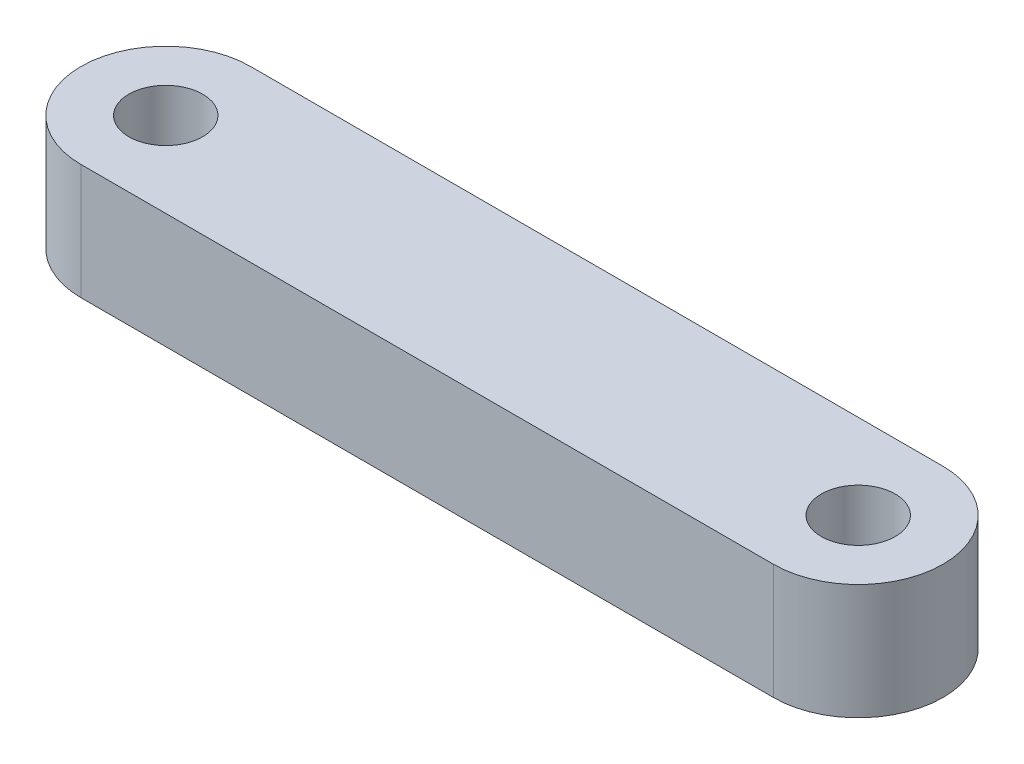
ISO-10303-21;
HEADER;
FILE_DESCRIPTION(('STEP AP214'),'2;1');
FILE_NAME('part.step','',(''),(''),'','','');
FILE_SCHEMA(('AUTOMOTIVE_DESIGN { 1 0 10303 214 1 1 1 1 }'));
ENDSEC;
DATA;
#1=APPLICATION_CONTEXT('core data for automotive mechanical design processes');
#2=APPLICATION_PROTOCOL_DEFINITION('international standard','automotive_design',2000,#1);
#3=PRODUCT_CONTEXT('',#1,'mechanical');
#4=PRODUCT('Part','Part','',(#3));
#5=PRODUCT_RELATED_PRODUCT_CATEGORY('part','',(#4));
#6=PRODUCT_DEFINITION_FORMATION('','',#4);
#7=PRODUCT_DEFINITION_CONTEXT('part definition',#1,'design');
#8=PRODUCT_DEFINITION('design','',#6,#7);
#9=PRODUCT_DEFINITION_SHAPE('','',#8);
#10=(LENGTH_UNIT() NAMED_UNIT(*) SI_UNIT(.MILLI.,.METRE.));
#11=(NAMED_UNIT(*) PLANE_ANGLE_UNIT() SI_UNIT($,.RADIAN.));
#12=(NAMED_UNIT(*) SI_UNIT($,.STERADIAN.) SOLID_ANGLE_UNIT());
#13=UNCERTAINTY_MEASURE_WITH_UNIT(LENGTH_MEASURE(1.E-05),#10,'distance_accuracy_value','');
#14=(GEOMETRIC_REPRESENTATION_CONTEXT(3) GLOBAL_UNCERTAINTY_ASSIGNED_CONTEXT((#13)) GLOBAL_UNIT_ASSIGNED_CONTEXT((#10,
#11,#12)) REPRESENTATION_CONTEXT('',''));
#15=CARTESIAN_POINT('',(0.,0.,0.));
#16=DIRECTION('',(0.,0.,1.));
#17=DIRECTION('',(1.,0.,0.));
#18=AXIS2_PLACEMENT_3D('',#15,#16,#17);
#19=CARTESIAN_POINT('',(0.,5.,0.));
#20=DIRECTION('',(0.,1.,0.));
#21=DIRECTION('',(0.,0.,1.));
#22=AXIS2_PLACEMENT_3D('',#19,#20,#21);
#23=PLANE('',#22);
#24=CARTESIAN_POINT('',(-30.,5.,0.));
#25=DIRECTION('',(0.,1.,0.));
#26=DIRECTION('',(0.,0.,1.));
#27=AXIS2_PLACEMENT_3D('',#24,#25,#26);
#28=CIRCLE('',#27,1.6);
#29=CARTESIAN_POINT('',(-30.,5.,1.6));
#30=VERTEX_POINT('',#29);
#31=EDGE_CURVE('E110',#30,#30,#28,.T.);
#32=ORIENTED_EDGE('',*,*,#31,.F.);
#33=EDGE_LOOP('',(#32));
#34=FACE_BOUND('',#33,.T.);
#35=CARTESIAN_POINT('',(0.,5.,0.));
#36=DIRECTION('',(0.,1.,0.));
#37=DIRECTION('',(0.,0.,1.));
#38=AXIS2_PLACEMENT_3D('',#35,#36,#37);
#39=CIRCLE('',#38,3.675);
#40=CARTESIAN_POINT('',(0.,5.,3.675));
#41=VERTEX_POINT('',#40);
#42=CARTESIAN_POINT('',(0.,5.,-3.675));
#43=VERTEX_POINT('',#42);
#44=EDGE_CURVE('E94',#41,#43,#39,.T.);
#45=ORIENTED_EDGE('',*,*,#44,.T.);
#46=DIRECTION('',(-1.,0.,0.));
#47=VECTOR('',#46,1.);
#48=CARTESIAN_POINT('',(0.,5.,-3.675));
#49=LINE('',#48,#47);
#50=CARTESIAN_POINT('',(-30.,5.,-3.675));
#51=VERTEX_POINT('',#50);
#52=EDGE_CURVE('E89',#43,#51,#49,.T.);
#53=ORIENTED_EDGE('',*,*,#52,.T.);
#54=CARTESIAN_POINT('',(-30.,5.,0.));
#55=DIRECTION('',(0.,1.,0.));
#56=DIRECTION('',(0.,0.,1.));
#57=AXIS2_PLACEMENT_3D('',#54,#55,#56);
#58=CIRCLE('',#57,3.675);
#59=CARTESIAN_POINT('',(-30.,5.,3.675));
#60=VERTEX_POINT('',#59);
#61=EDGE_CURVE('E93',#51,#60,#58,.T.);
#62=ORIENTED_EDGE('',*,*,#61,.T.);
#63=DIRECTION('',(1.,0.,0.));
#64=VECTOR('',#63,1.);
#65=CARTESIAN_POINT('',(0.,5.,3.675));
#66=LINE('',#65,#64);
#67=EDGE_CURVE('E58',#60,#41,#66,.T.);
#68=ORIENTED_EDGE('',*,*,#67,.T.);
#69=EDGE_LOOP('',(#45,#53,#62,#68));
#70=FACE_BOUND('',#69,.T.);
#71=CARTESIAN_POINT('',(0.,5.,0.));
#72=DIRECTION('',(0.,1.,0.));
#73=DIRECTION('',(0.,0.,1.));
#74=AXIS2_PLACEMENT_3D('',#71,#72,#73);
#75=CIRCLE('',#74,1.6);
#76=CARTESIAN_POINT('',(0.,5.,1.6));
#77=VERTEX_POINT('',#76);
#78=EDGE_CURVE('E124',#77,#77,#75,.T.);
#79=ORIENTED_EDGE('',*,*,#78,.F.);
#80=EDGE_LOOP('',(#79));
#81=FACE_BOUND('',#80,.T.);
#82=ADVANCED_FACE('F43',(#34,#70,#81),#23,.T.);
#83=CARTESIAN_POINT('',(0.,0.,0.));
#84=DIRECTION('',(0.,1.,0.));
#85=DIRECTION('',(0.,0.,1.));
#86=AXIS2_PLACEMENT_3D('',#83,#84,#85);
#87=PLANE('',#86);
#88=CARTESIAN_POINT('',(0.,0.,0.));
#89=DIRECTION('',(0.,1.,0.));
#90=DIRECTION('',(0.,0.,1.));
#91=AXIS2_PLACEMENT_3D('',#88,#89,#90);
#92=CIRCLE('',#91,3.675);
#93=CARTESIAN_POINT('',(0.,0.,3.675));
#94=VERTEX_POINT('',#93);
#95=CARTESIAN_POINT('',(0.,0.,-3.675));
#96=VERTEX_POINT('',#95);
#97=EDGE_CURVE('E107',#94,#96,#92,.T.);
#98=ORIENTED_EDGE('',*,*,#97,.F.);
#99=DIRECTION('',(1.,0.,0.));
#100=VECTOR('',#99,1.);
#101=CARTESIAN_POINT('',(0.,0.,3.675));
#102=LINE('',#101,#100);
#103=CARTESIAN_POINT('',(-30.,0.,3.675));
#104=VERTEX_POINT('',#103);
#105=EDGE_CURVE('E81',#104,#94,#102,.T.);
#106=ORIENTED_EDGE('',*,*,#105,.F.);
#107=CARTESIAN_POINT('',(-30.,0.,0.));
#108=DIRECTION('',(0.,1.,0.));
#109=DIRECTION('',(0.,0.,1.));
#110=AXIS2_PLACEMENT_3D('',#107,#108,#109);
#111=CIRCLE('',#110,3.675);
#112=CARTESIAN_POINT('',(-30.,0.,-3.675));
#113=VERTEX_POINT('',#112);
#114=EDGE_CURVE('E77',#113,#104,#111,.T.);
#115=ORIENTED_EDGE('',*,*,#114,.F.);
#116=DIRECTION('',(-1.,0.,0.));
#117=VECTOR('',#116,1.);
#118=CARTESIAN_POINT('',(0.,0.,-3.675));
#119=LINE('',#118,#117);
#120=EDGE_CURVE('E98',#96,#113,#119,.T.);
#121=ORIENTED_EDGE('',*,*,#120,.F.);
#122=EDGE_LOOP('',(#98,#106,#115,#121));
#123=FACE_BOUND('',#122,.T.);
#124=CARTESIAN_POINT('',(-30.,0.,0.));
#125=DIRECTION('',(0.,1.,0.));
#126=DIRECTION('',(0.,0.,1.));
#127=AXIS2_PLACEMENT_3D('',#124,#125,#126);
#128=CIRCLE('',#127,1.6);
#129=CARTESIAN_POINT('',(-30.,0.,1.6));
#130=VERTEX_POINT('',#129);
#131=EDGE_CURVE('E122',#130,#130,#128,.T.);
#132=ORIENTED_EDGE('',*,*,#131,.T.);
#133=EDGE_LOOP('',(#132));
#134=FACE_BOUND('',#133,.T.);
#135=CARTESIAN_POINT('',(0.,0.,0.));
#136=DIRECTION('',(0.,1.,0.));
#137=DIRECTION('',(0.,0.,1.));
#138=AXIS2_PLACEMENT_3D('',#135,#136,#137);
#139=CIRCLE('',#138,1.6);
#140=CARTESIAN_POINT('',(0.,0.,1.6));
#141=VERTEX_POINT('',#140);
#142=EDGE_CURVE('E126',#141,#141,#139,.T.);
#143=ORIENTED_EDGE('',*,*,#142,.T.);
#144=EDGE_LOOP('',(#143));
#145=FACE_BOUND('',#144,.T.);
#146=ADVANCED_FACE('F119',(#123,#134,#145),#87,.F.);
#147=CARTESIAN_POINT('',(0.,5.,0.));
#148=DIRECTION('',(0.,-1.,0.));
#149=DIRECTION('',(0.,0.,-1.));
#150=AXIS2_PLACEMENT_3D('',#147,#148,#149);
#151=CYLINDRICAL_SURFACE('',#150,3.675);
#152=ORIENTED_EDGE('',*,*,#97,.T.);
#153=DIRECTION('',(0.,-1.,0.));
#154=VECTOR('',#153,1.);
#155=CARTESIAN_POINT('',(0.,5.,-3.675));
#156=LINE('',#155,#154);
#157=EDGE_CURVE('E11',#43,#96,#156,.T.);
#158=ORIENTED_EDGE('',*,*,#157,.F.);
#159=ORIENTED_EDGE('',*,*,#44,.F.);
#160=DIRECTION('',(0.,-1.,0.));
#161=VECTOR('',#160,1.);
#162=CARTESIAN_POINT('',(0.,5.,3.675));
#163=LINE('',#162,#161);
#164=EDGE_CURVE('E104',#41,#94,#163,.T.);
#165=ORIENTED_EDGE('',*,*,#164,.T.);
#166=EDGE_LOOP('',(#152,#158,#159,#165));
#167=FACE_BOUND('',#166,.T.);
#168=ADVANCED_FACE('F44',(#167),#151,.T.);
#169=CARTESIAN_POINT('',(0.,5.,-3.675));
#170=DIRECTION('',(0.,0.,1.));
#171=DIRECTION('',(1.,0.,0.));
#172=AXIS2_PLACEMENT_3D('',#169,#170,#171);
#173=PLANE('',#172);
#174=ORIENTED_EDGE('',*,*,#120,.T.);
#175=DIRECTION('',(0.,-1.,0.));
#176=VECTOR('',#175,1.);
#177=CARTESIAN_POINT('',(-30.,5.,-3.675));
#178=LINE('',#177,#176);
#179=EDGE_CURVE('E55',#51,#113,#178,.T.);
#180=ORIENTED_EDGE('',*,*,#179,.F.);
#181=ORIENTED_EDGE('',*,*,#52,.F.);
#182=ORIENTED_EDGE('',*,*,#157,.T.);
#183=EDGE_LOOP('',(#174,#180,#181,#182));
#184=FACE_BOUND('',#183,.T.);
#185=ADVANCED_FACE('F97',(#184),#173,.F.);
#186=CARTESIAN_POINT('',(-30.,5.,0.));
#187=DIRECTION('',(0.,-1.,0.));
#188=DIRECTION('',(0.,0.,-1.));
#189=AXIS2_PLACEMENT_3D('',#186,#187,#188);
#190=CYLINDRICAL_SURFACE('',#189,3.675);
#191=ORIENTED_EDGE('',*,*,#114,.T.);
#192=DIRECTION('',(0.,-1.,0.));
#193=VECTOR('',#192,1.);
#194=CARTESIAN_POINT('',(-30.,5.,3.675));
#195=LINE('',#194,#193);
#196=EDGE_CURVE('E99',#60,#104,#195,.T.);
#197=ORIENTED_EDGE('',*,*,#196,.F.);
#198=ORIENTED_EDGE('',*,*,#61,.F.);
#199=ORIENTED_EDGE('',*,*,#179,.T.);
#200=EDGE_LOOP('',(#191,#197,#198,#199));
#201=FACE_BOUND('',#200,.T.);
#202=ADVANCED_FACE('F102',(#201),#190,.T.);
#203=CARTESIAN_POINT('',(0.,5.,3.675));
#204=DIRECTION('',(0.,0.,-1.));
#205=DIRECTION('',(-1.,0.,0.));
#206=AXIS2_PLACEMENT_3D('',#203,#204,#205);
#207=PLANE('',#206);
#208=ORIENTED_EDGE('',*,*,#105,.T.);
#209=ORIENTED_EDGE('',*,*,#164,.F.);
#210=ORIENTED_EDGE('',*,*,#67,.F.);
#211=ORIENTED_EDGE('',*,*,#196,.T.);
#212=EDGE_LOOP('',(#208,#209,#210,#211));
#213=FACE_BOUND('',#212,.T.);
#214=ADVANCED_FACE('F113',(#213),#207,.F.);
#215=CARTESIAN_POINT('',(-30.,5.,0.));
#216=DIRECTION('',(0.,-1.,0.));
#217=DIRECTION('',(0.,0.,-1.));
#218=AXIS2_PLACEMENT_3D('',#215,#216,#217);
#219=CYLINDRICAL_SURFACE('',#218,1.6);
#220=ORIENTED_EDGE('',*,*,#31,.T.);
#221=EDGE_LOOP('',(#220));
#222=FACE_BOUND('',#221,.T.);
#223=ORIENTED_EDGE('',*,*,#131,.F.);
#224=EDGE_LOOP('',(#223));
#225=FACE_BOUND('',#224,.T.);
#226=ADVANCED_FACE('F144',(#222,#225),#219,.F.);
#227=CARTESIAN_POINT('',(0.,5.,0.));
#228=DIRECTION('',(0.,-1.,0.));
#229=DIRECTION('',(0.,0.,-1.));
#230=AXIS2_PLACEMENT_3D('',#227,#228,#229);
#231=CYLINDRICAL_SURFACE('',#230,1.6);
#232=ORIENTED_EDGE('',*,*,#78,.T.);
#233=EDGE_LOOP('',(#232));
#234=FACE_BOUND('',#233,.T.);
#235=ORIENTED_EDGE('',*,*,#142,.F.);
#236=EDGE_LOOP('',(#235));
#237=FACE_BOUND('',#236,.T.);
#238=ADVANCED_FACE('F132',(#234,#237),#231,.F.);
#239=CLOSED_SHELL('',(#82,#146,#168,#185,#202,#214,#226,#238));
#240=MANIFOLD_SOLID_BREP('B2',#239);
#241=ADVANCED_BREP_SHAPE_REPRESENTATION('',(#18,#240),#14);
#242=SHAPE_DEFINITION_REPRESENTATION(#9,#241);
ENDSEC;
END-ISO-10303-21;
